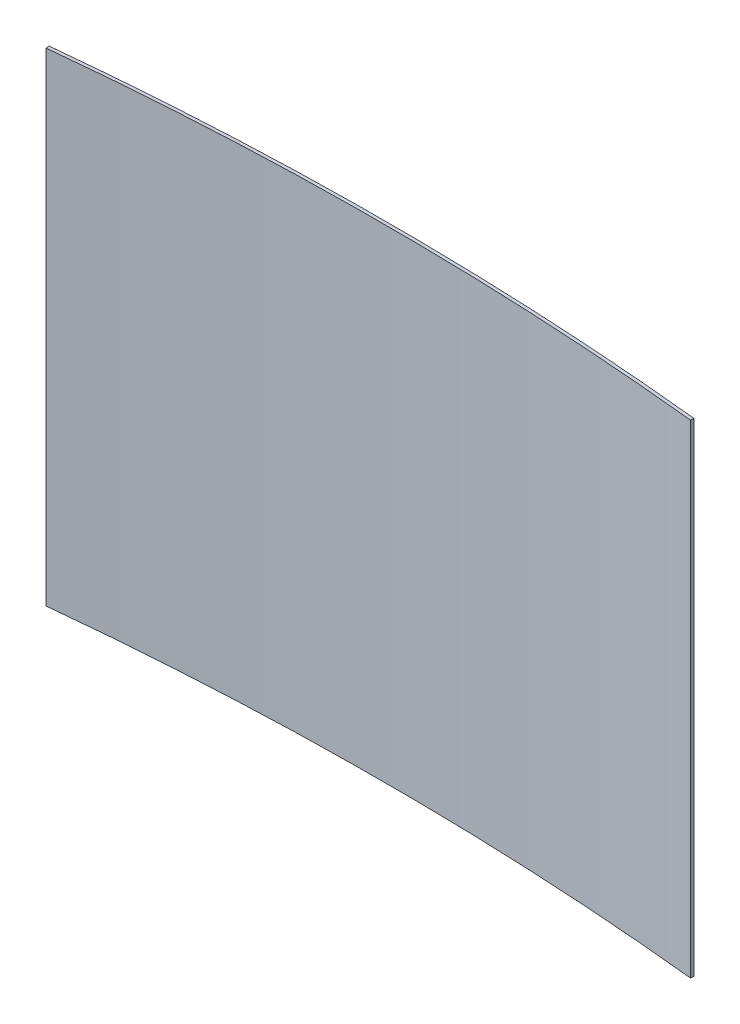
ISO-10303-21;
HEADER;
FILE_DESCRIPTION(('STEP AP214'),'2;1');
FILE_NAME('part.step','',(''),(''),'','','');
FILE_SCHEMA(('AUTOMOTIVE_DESIGN { 1 0 10303 214 1 1 1 1 }'));
ENDSEC;
DATA;
#1=APPLICATION_CONTEXT('core data for automotive mechanical design processes');
#2=APPLICATION_PROTOCOL_DEFINITION('international standard','automotive_design',2000,#1);
#3=PRODUCT_CONTEXT('',#1,'mechanical');
#4=PRODUCT('Part','Part','',(#3));
#5=PRODUCT_RELATED_PRODUCT_CATEGORY('part','',(#4));
#6=PRODUCT_DEFINITION_FORMATION('','',#4);
#7=PRODUCT_DEFINITION_CONTEXT('part definition',#1,'design');
#8=PRODUCT_DEFINITION('design','',#6,#7);
#9=PRODUCT_DEFINITION_SHAPE('','',#8);
#10=(LENGTH_UNIT() NAMED_UNIT(*) SI_UNIT(.MILLI.,.METRE.));
#11=(NAMED_UNIT(*) PLANE_ANGLE_UNIT() SI_UNIT($,.RADIAN.));
#12=(NAMED_UNIT(*) SI_UNIT($,.STERADIAN.) SOLID_ANGLE_UNIT());
#13=UNCERTAINTY_MEASURE_WITH_UNIT(LENGTH_MEASURE(1.E-05),#10,'distance_accuracy_value','');
#14=(GEOMETRIC_REPRESENTATION_CONTEXT(3) GLOBAL_UNCERTAINTY_ASSIGNED_CONTEXT((#13)) GLOBAL_UNIT_ASSIGNED_CONTEXT((#10,
#11,#12)) REPRESENTATION_CONTEXT('',''));
#15=CARTESIAN_POINT('',(0.,0.,0.));
#16=DIRECTION('',(0.,0.,1.));
#17=DIRECTION('',(1.,0.,0.));
#18=AXIS2_PLACEMENT_3D('',#15,#16,#17);
#19=CARTESIAN_POINT('',(0.,75.,0.));
#20=DIRECTION('',(0.,-1.,0.));
#21=DIRECTION('',(0.,0.,-1.));
#22=AXIS2_PLACEMENT_3D('',#19,#20,#21);
#23=CYLINDRICAL_SURFACE('',#22,978.5);
#24=CARTESIAN_POINT('',(0.,-75.,0.));
#25=DIRECTION('',(0.,1.,0.));
#26=DIRECTION('',(1.,0.,0.));
#27=AXIS2_PLACEMENT_3D('',#24,#25,#26);
#28=CIRCLE('',#27,978.5);
#29=CARTESIAN_POINT('',(100.102301790281,-75.,-973.366210208823));
#30=VERTEX_POINT('',#29);
#31=CARTESIAN_POINT('',(-100.102301790281,-75.,-973.366210208823));
#32=VERTEX_POINT('',#31);
#33=EDGE_CURVE('E101',#30,#32,#28,.T.);
#34=ORIENTED_EDGE('',*,*,#33,.T.);
#35=DIRECTION('',(0.,-1.,0.));
#36=VECTOR('',#35,1.);
#37=CARTESIAN_POINT('',(-100.102301790281,75.,-973.366210208823));
#38=LINE('',#37,#36);
#39=CARTESIAN_POINT('',(-100.102301790281,75.,-973.366210208823));
#40=VERTEX_POINT('',#39);
#41=EDGE_CURVE('E11',#40,#32,#38,.T.);
#42=ORIENTED_EDGE('',*,*,#41,.F.);
#43=CARTESIAN_POINT('',(0.,75.,0.));
#44=DIRECTION('',(0.,1.,0.));
#45=DIRECTION('',(1.,0.,0.));
#46=AXIS2_PLACEMENT_3D('',#43,#44,#45);
#47=CIRCLE('',#46,978.5);
#48=CARTESIAN_POINT('',(100.102301790281,75.,-973.366210208823));
#49=VERTEX_POINT('',#48);
#50=EDGE_CURVE('E78',#49,#40,#47,.T.);
#51=ORIENTED_EDGE('',*,*,#50,.F.);
#52=DIRECTION('',(0.,-1.,0.));
#53=VECTOR('',#52,1.);
#54=CARTESIAN_POINT('',(100.102301790281,75.,-973.366210208823));
#55=LINE('',#54,#53);
#56=EDGE_CURVE('E54',#49,#30,#55,.T.);
#57=ORIENTED_EDGE('',*,*,#56,.T.);
#58=EDGE_LOOP('',(#34,#42,#51,#57));
#59=FACE_BOUND('',#58,.T.);
#60=ADVANCED_FACE('F38',(#59),#23,.T.);
#61=CARTESIAN_POINT('',(-100.,75.,-972.371456800332));
#62=DIRECTION('',(-0.994753408491382,0.,0.102301790281388));
#63=DIRECTION('',(0.102301790281388,0.,0.994753408491382));
#64=AXIS2_PLACEMENT_3D('',#61,#62,#63);
#65=PLANE('',#64);
#66=DIRECTION('',(-0.102301790281388,0.,-0.994753408491382));
#67=VECTOR('',#66,1.);
#68=CARTESIAN_POINT('',(-100.,-75.,-972.371456800332));
#69=LINE('',#68,#67);
#70=CARTESIAN_POINT('',(-100.,-75.,-972.371456800332));
#71=VERTEX_POINT('',#70);
#72=EDGE_CURVE('E87',#71,#32,#69,.T.);
#73=ORIENTED_EDGE('',*,*,#72,.F.);
#74=DIRECTION('',(0.,-1.,0.));
#75=VECTOR('',#74,1.);
#76=CARTESIAN_POINT('',(-100.,75.,-972.371456800332));
#77=LINE('',#76,#75);
#78=CARTESIAN_POINT('',(-100.,75.,-972.371456800332));
#79=VERTEX_POINT('',#78);
#80=EDGE_CURVE('E46',#79,#71,#77,.T.);
#81=ORIENTED_EDGE('',*,*,#80,.F.);
#82=DIRECTION('',(-0.102301790281388,0.,-0.994753408491382));
#83=VECTOR('',#82,1.);
#84=CARTESIAN_POINT('',(-100.,75.,-972.371456800332));
#85=LINE('',#84,#83);
#86=EDGE_CURVE('E85',#79,#40,#85,.T.);
#87=ORIENTED_EDGE('',*,*,#86,.T.);
#88=ORIENTED_EDGE('',*,*,#41,.T.);
#89=EDGE_LOOP('',(#73,#81,#87,#88));
#90=FACE_BOUND('',#89,.T.);
#91=ADVANCED_FACE('F84',(#90),#65,.T.);
#92=CARTESIAN_POINT('',(0.,75.,0.));
#93=DIRECTION('',(0.,-1.,0.));
#94=DIRECTION('',(0.,0.,-1.));
#95=AXIS2_PLACEMENT_3D('',#92,#93,#94);
#96=CYLINDRICAL_SURFACE('',#95,977.5);
#97=CARTESIAN_POINT('',(0.,-75.,0.));
#98=DIRECTION('',(0.,1.,0.));
#99=DIRECTION('',(0.,0.,1.));
#100=AXIS2_PLACEMENT_3D('',#97,#98,#99);
#101=CIRCLE('',#100,977.5);
#102=CARTESIAN_POINT('',(99.9999999999998,-75.,-972.371456800332));
#103=VERTEX_POINT('',#102);
#104=EDGE_CURVE('E104',#103,#71,#101,.T.);
#105=ORIENTED_EDGE('',*,*,#104,.F.);
#106=DIRECTION('',(0.,-1.,0.));
#107=VECTOR('',#106,1.);
#108=CARTESIAN_POINT('',(99.9999999999998,75.,-972.371456800332));
#109=LINE('',#108,#107);
#110=CARTESIAN_POINT('',(99.9999999999998,75.,-972.371456800332));
#111=VERTEX_POINT('',#110);
#112=EDGE_CURVE('E67',#111,#103,#109,.T.);
#113=ORIENTED_EDGE('',*,*,#112,.F.);
#114=CARTESIAN_POINT('',(0.,75.,0.));
#115=DIRECTION('',(0.,1.,0.));
#116=DIRECTION('',(0.,0.,1.));
#117=AXIS2_PLACEMENT_3D('',#114,#115,#116);
#118=CIRCLE('',#117,977.5);
#119=EDGE_CURVE('E93',#111,#79,#118,.T.);
#120=ORIENTED_EDGE('',*,*,#119,.T.);
#121=ORIENTED_EDGE('',*,*,#80,.T.);
#122=EDGE_LOOP('',(#105,#113,#120,#121));
#123=FACE_BOUND('',#122,.T.);
#124=ADVANCED_FACE('F95',(#123),#96,.F.);
#125=CARTESIAN_POINT('',(100.102301790281,75.,-973.366210208823));
#126=DIRECTION('',(0.994753408491395,0.,0.102301790281265));
#127=DIRECTION('',(0.102301790281265,0.,-0.994753408491395));
#128=AXIS2_PLACEMENT_3D('',#125,#126,#127);
#129=PLANE('',#128);
#130=DIRECTION('',(-0.102301790281265,0.,0.994753408491395));
#131=VECTOR('',#130,1.);
#132=CARTESIAN_POINT('',(100.102301790281,-75.,-973.366210208823));
#133=LINE('',#132,#131);
#134=EDGE_CURVE('E106',#30,#103,#133,.T.);
#135=ORIENTED_EDGE('',*,*,#134,.F.);
#136=ORIENTED_EDGE('',*,*,#56,.F.);
#137=DIRECTION('',(-0.102301790281265,0.,0.994753408491395));
#138=VECTOR('',#137,1.);
#139=CARTESIAN_POINT('',(100.102301790281,75.,-973.366210208823));
#140=LINE('',#139,#138);
#141=EDGE_CURVE('E96',#49,#111,#140,.T.);
#142=ORIENTED_EDGE('',*,*,#141,.T.);
#143=ORIENTED_EDGE('',*,*,#112,.T.);
#144=EDGE_LOOP('',(#135,#136,#142,#143));
#145=FACE_BOUND('',#144,.T.);
#146=ADVANCED_FACE('F112',(#145),#129,.T.);
#147=CARTESIAN_POINT('',(0.,75.,0.));
#148=DIRECTION('',(0.,1.,0.));
#149=DIRECTION('',(1.,0.,0.));
#150=AXIS2_PLACEMENT_3D('',#147,#148,#149);
#151=PLANE('',#150);
#152=ORIENTED_EDGE('',*,*,#50,.T.);
#153=ORIENTED_EDGE('',*,*,#86,.F.);
#154=ORIENTED_EDGE('',*,*,#119,.F.);
#155=ORIENTED_EDGE('',*,*,#141,.F.);
#156=EDGE_LOOP('',(#152,#153,#154,#155));
#157=FACE_BOUND('',#156,.T.);
#158=ADVANCED_FACE('F92',(#157),#151,.T.);
#159=CARTESIAN_POINT('',(0.,-75.,0.));
#160=DIRECTION('',(0.,1.,0.));
#161=DIRECTION('',(1.,0.,0.));
#162=AXIS2_PLACEMENT_3D('',#159,#160,#161);
#163=PLANE('',#162);
#164=ORIENTED_EDGE('',*,*,#33,.F.);
#165=ORIENTED_EDGE('',*,*,#134,.T.);
#166=ORIENTED_EDGE('',*,*,#104,.T.);
#167=ORIENTED_EDGE('',*,*,#72,.T.);
#168=EDGE_LOOP('',(#164,#165,#166,#167));
#169=FACE_BOUND('',#168,.T.);
#170=ADVANCED_FACE('F111',(#169),#163,.F.);
#171=CLOSED_SHELL('',(#60,#91,#124,#146,#158,#170));
#172=MANIFOLD_SOLID_BREP('B2',#171);
#173=ADVANCED_BREP_SHAPE_REPRESENTATION('',(#18,#172),#14);
#174=SHAPE_DEFINITION_REPRESENTATION(#9,#173);
ENDSEC;
END-ISO-10303-21;
